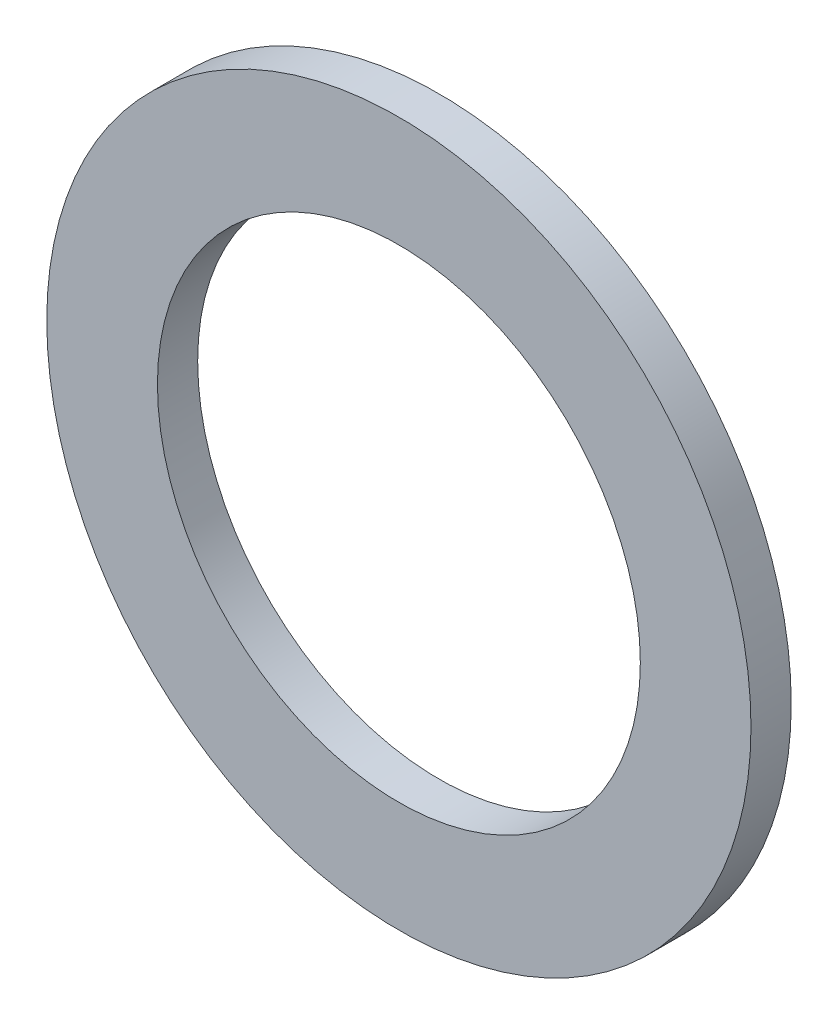
ISO-10303-21;
HEADER;
FILE_DESCRIPTION(('STEP AP214'),'2;1');
FILE_NAME('part.step','',(''),(''),'','','');
FILE_SCHEMA(('AUTOMOTIVE_DESIGN { 1 0 10303 214 1 1 1 1 }'));
ENDSEC;
DATA;
#1=APPLICATION_CONTEXT('core data for automotive mechanical design processes');
#2=APPLICATION_PROTOCOL_DEFINITION('international standard','automotive_design',2000,#1);
#3=PRODUCT_CONTEXT('',#1,'mechanical');
#4=PRODUCT('Part','Part','',(#3));
#5=PRODUCT_RELATED_PRODUCT_CATEGORY('part','',(#4));
#6=PRODUCT_DEFINITION_FORMATION('','',#4);
#7=PRODUCT_DEFINITION_CONTEXT('part definition',#1,'design');
#8=PRODUCT_DEFINITION('design','',#6,#7);
#9=PRODUCT_DEFINITION_SHAPE('','',#8);
#10=(LENGTH_UNIT() NAMED_UNIT(*) SI_UNIT(.MILLI.,.METRE.));
#11=(NAMED_UNIT(*) PLANE_ANGLE_UNIT() SI_UNIT($,.RADIAN.));
#12=(NAMED_UNIT(*) SI_UNIT($,.STERADIAN.) SOLID_ANGLE_UNIT());
#13=UNCERTAINTY_MEASURE_WITH_UNIT(LENGTH_MEASURE(1.E-05),#10,'distance_accuracy_value','');
#14=(GEOMETRIC_REPRESENTATION_CONTEXT(3) GLOBAL_UNCERTAINTY_ASSIGNED_CONTEXT((#13)) GLOBAL_UNIT_ASSIGNED_CONTEXT((#10,
#11,#12)) REPRESENTATION_CONTEXT('',''));
#15=CARTESIAN_POINT('',(0.,0.,0.));
#16=DIRECTION('',(0.,0.,1.));
#17=DIRECTION('',(1.,0.,0.));
#18=AXIS2_PLACEMENT_3D('',#15,#16,#17);
#19=CARTESIAN_POINT('',(0.,0.,-1.));
#20=DIRECTION('',(0.,0.,1.));
#21=DIRECTION('',(1.,0.,0.));
#22=AXIS2_PLACEMENT_3D('',#19,#20,#21);
#23=CYLINDRICAL_SURFACE('',#22,8.75);
#24=CARTESIAN_POINT('',(0.,0.,-1.));
#25=DIRECTION('',(0.,0.,1.));
#26=DIRECTION('',(1.,0.,0.));
#27=AXIS2_PLACEMENT_3D('',#24,#25,#26);
#28=CIRCLE('',#27,8.75);
#29=CARTESIAN_POINT('',(8.75,0.,-1.));
#30=VERTEX_POINT('',#29);
#31=EDGE_CURVE('E10',#30,#30,#28,.T.);
#32=ORIENTED_EDGE('',*,*,#31,.T.);
#33=EDGE_LOOP('',(#32));
#34=FACE_BOUND('',#33,.T.);
#35=CARTESIAN_POINT('',(0.,0.,0.));
#36=DIRECTION('',(0.,0.,1.));
#37=DIRECTION('',(1.,0.,0.));
#38=AXIS2_PLACEMENT_3D('',#35,#36,#37);
#39=CIRCLE('',#38,8.75);
#40=CARTESIAN_POINT('',(8.75,0.,0.));
#41=VERTEX_POINT('',#40);
#42=EDGE_CURVE('E40',#41,#41,#39,.T.);
#43=ORIENTED_EDGE('',*,*,#42,.F.);
#44=EDGE_LOOP('',(#43));
#45=FACE_BOUND('',#44,.T.);
#46=ADVANCED_FACE('F37',(#34,#45),#23,.T.);
#47=CARTESIAN_POINT('',(0.,0.,-1.));
#48=DIRECTION('',(0.,0.,1.));
#49=DIRECTION('',(1.,0.,0.));
#50=AXIS2_PLACEMENT_3D('',#47,#48,#49);
#51=PLANE('',#50);
#52=CARTESIAN_POINT('',(0.,0.,-1.));
#53=DIRECTION('',(0.,0.,1.));
#54=DIRECTION('',(1.,0.,0.));
#55=AXIS2_PLACEMENT_3D('',#52,#53,#54);
#56=CIRCLE('',#55,6.);
#57=CARTESIAN_POINT('',(6.,0.,-1.));
#58=VERTEX_POINT('',#57);
#59=EDGE_CURVE('E49',#58,#58,#56,.T.);
#60=ORIENTED_EDGE('',*,*,#59,.T.);
#61=EDGE_LOOP('',(#60));
#62=FACE_BOUND('',#61,.T.);
#63=ORIENTED_EDGE('',*,*,#31,.F.);
#64=EDGE_LOOP('',(#63));
#65=FACE_BOUND('',#64,.T.);
#66=ADVANCED_FACE('F59',(#62,#65),#51,.F.);
#67=CARTESIAN_POINT('',(0.,0.,0.));
#68=DIRECTION('',(0.,0.,1.));
#69=DIRECTION('',(1.,0.,0.));
#70=AXIS2_PLACEMENT_3D('',#67,#68,#69);
#71=PLANE('',#70);
#72=CARTESIAN_POINT('',(0.,0.,0.));
#73=DIRECTION('',(0.,0.,1.));
#74=DIRECTION('',(1.,0.,0.));
#75=AXIS2_PLACEMENT_3D('',#72,#73,#74);
#76=CIRCLE('',#75,6.);
#77=CARTESIAN_POINT('',(6.,0.,0.));
#78=VERTEX_POINT('',#77);
#79=EDGE_CURVE('E51',#78,#78,#76,.T.);
#80=ORIENTED_EDGE('',*,*,#79,.F.);
#81=EDGE_LOOP('',(#80));
#82=FACE_BOUND('',#81,.T.);
#83=ORIENTED_EDGE('',*,*,#42,.T.);
#84=EDGE_LOOP('',(#83));
#85=FACE_BOUND('',#84,.T.);
#86=ADVANCED_FACE('F65',(#82,#85),#71,.T.);
#87=CARTESIAN_POINT('',(0.,0.,-1.));
#88=DIRECTION('',(0.,0.,1.));
#89=DIRECTION('',(1.,0.,0.));
#90=AXIS2_PLACEMENT_3D('',#87,#88,#89);
#91=CYLINDRICAL_SURFACE('',#90,6.);
#92=ORIENTED_EDGE('',*,*,#59,.F.);
#93=EDGE_LOOP('',(#92));
#94=FACE_BOUND('',#93,.T.);
#95=ORIENTED_EDGE('',*,*,#79,.T.);
#96=EDGE_LOOP('',(#95));
#97=FACE_BOUND('',#96,.T.);
#98=ADVANCED_FACE('F62',(#94,#97),#91,.F.);
#99=CLOSED_SHELL('',(#46,#66,#86,#98));
#100=MANIFOLD_SOLID_BREP('B2',#99);
#101=ADVANCED_BREP_SHAPE_REPRESENTATION('',(#18,#100),#14);
#102=SHAPE_DEFINITION_REPRESENTATION(#9,#101);
ENDSEC;
END-ISO-10303-21;
